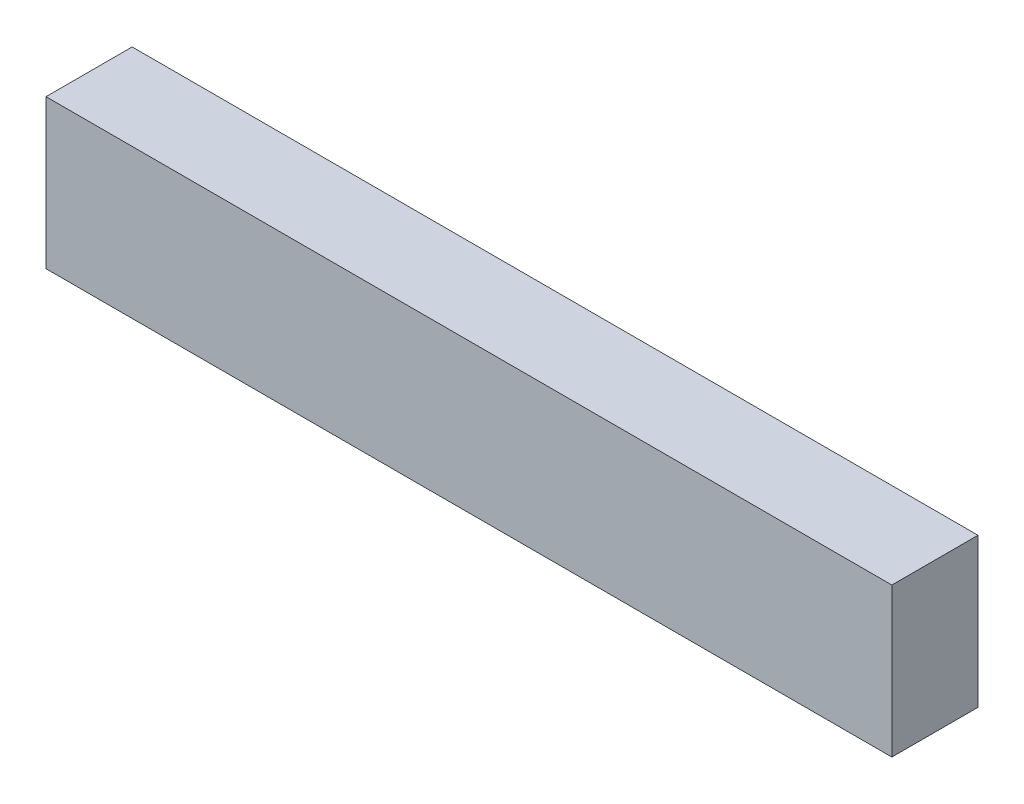
ISO-10303-21;
HEADER;
FILE_DESCRIPTION(('STEP AP214'),'2;1');
FILE_NAME('part.step','',(''),(''),'','','');
FILE_SCHEMA(('AUTOMOTIVE_DESIGN { 1 0 10303 214 1 1 1 1 }'));
ENDSEC;
DATA;
#1=APPLICATION_CONTEXT('core data for automotive mechanical design processes');
#2=APPLICATION_PROTOCOL_DEFINITION('international standard','automotive_design',2000,#1);
#3=PRODUCT_CONTEXT('',#1,'mechanical');
#4=PRODUCT('Part','Part','',(#3));
#5=PRODUCT_RELATED_PRODUCT_CATEGORY('part','',(#4));
#6=PRODUCT_DEFINITION_FORMATION('','',#4);
#7=PRODUCT_DEFINITION_CONTEXT('part definition',#1,'design');
#8=PRODUCT_DEFINITION('design','',#6,#7);
#9=PRODUCT_DEFINITION_SHAPE('','',#8);
#10=(LENGTH_UNIT() NAMED_UNIT(*) SI_UNIT(.MILLI.,.METRE.));
#11=(NAMED_UNIT(*) PLANE_ANGLE_UNIT() SI_UNIT($,.RADIAN.));
#12=(NAMED_UNIT(*) SI_UNIT($,.STERADIAN.) SOLID_ANGLE_UNIT());
#13=UNCERTAINTY_MEASURE_WITH_UNIT(LENGTH_MEASURE(1.E-05),#10,'distance_accuracy_value','');
#14=(GEOMETRIC_REPRESENTATION_CONTEXT(3) GLOBAL_UNCERTAINTY_ASSIGNED_CONTEXT((#13)) GLOBAL_UNIT_ASSIGNED_CONTEXT((#10,
#11,#12)) REPRESENTATION_CONTEXT('',''));
#15=CARTESIAN_POINT('',(0.,0.,0.));
#16=DIRECTION('',(0.,0.,1.));
#17=DIRECTION('',(1.,0.,0.));
#18=AXIS2_PLACEMENT_3D('',#15,#16,#17);
#19=CARTESIAN_POINT('',(-79.0368014902547,-1.68999999999998,7.25));
#20=DIRECTION('',(1.,0.,0.));
#21=DIRECTION('',(0.,0.,-1.));
#22=AXIS2_PLACEMENT_3D('',#19,#20,#21);
#23=PLANE('',#22);
#24=DIRECTION('',(0.,-1.,0.));
#25=VECTOR('',#24,1.);
#26=CARTESIAN_POINT('',(-79.0368014902547,-1.68999999999998,0.));
#27=LINE('',#26,#25);
#28=CARTESIAN_POINT('',(-79.0368014902547,-1.68999999999998,0.));
#29=VERTEX_POINT('',#28);
#30=CARTESIAN_POINT('',(-79.0368014902547,-14.23,0.));
#31=VERTEX_POINT('',#30);
#32=EDGE_CURVE('E128',#29,#31,#27,.T.);
#33=ORIENTED_EDGE('',*,*,#32,.T.);
#34=DIRECTION('',(0.,0.,-1.));
#35=VECTOR('',#34,1.);
#36=CARTESIAN_POINT('',(-79.0368014902547,-14.23,7.25));
#37=LINE('',#36,#35);
#38=CARTESIAN_POINT('',(-79.0368014902547,-14.23,7.25));
#39=VERTEX_POINT('',#38);
#40=EDGE_CURVE('E11',#39,#31,#37,.T.);
#41=ORIENTED_EDGE('',*,*,#40,.F.);
#42=DIRECTION('',(0.,-1.,0.));
#43=VECTOR('',#42,1.);
#44=CARTESIAN_POINT('',(-79.0368014902547,-1.68999999999998,7.25));
#45=LINE('',#44,#43);
#46=CARTESIAN_POINT('',(-79.0368014902547,-1.68999999999998,7.25));
#47=VERTEX_POINT('',#46);
#48=EDGE_CURVE('E148',#47,#39,#45,.T.);
#49=ORIENTED_EDGE('',*,*,#48,.F.);
#50=DIRECTION('',(0.,0.,-1.));
#51=VECTOR('',#50,1.);
#52=CARTESIAN_POINT('',(-79.0368014902547,-1.68999999999998,7.25));
#53=LINE('',#52,#51);
#54=EDGE_CURVE('E153',#47,#29,#53,.T.);
#55=ORIENTED_EDGE('',*,*,#54,.T.);
#56=EDGE_LOOP('',(#33,#41,#49,#55));
#57=FACE_BOUND('',#56,.T.);
#58=ADVANCED_FACE('F32',(#57),#23,.F.);
#59=CARTESIAN_POINT('',(-79.0368014902547,-14.23,7.25));
#60=DIRECTION('',(0.,1.,0.));
#61=DIRECTION('',(0.,0.,1.));
#62=AXIS2_PLACEMENT_3D('',#59,#60,#61);
#63=PLANE('',#62);
#64=DIRECTION('',(1.,0.,0.));
#65=VECTOR('',#64,1.);
#66=CARTESIAN_POINT('',(-79.0368014902547,-14.23,0.));
#67=LINE('',#66,#65);
#68=CARTESIAN_POINT('',(-7.85549999999964,-14.23,0.));
#69=VERTEX_POINT('',#68);
#70=EDGE_CURVE('E132',#31,#69,#67,.T.);
#71=ORIENTED_EDGE('',*,*,#70,.T.);
#72=DIRECTION('',(0.,0.,-1.));
#73=VECTOR('',#72,1.);
#74=CARTESIAN_POINT('',(-7.85549999999964,-14.23,7.25));
#75=LINE('',#74,#73);
#76=CARTESIAN_POINT('',(-7.85549999999964,-14.23,7.25));
#77=VERTEX_POINT('',#76);
#78=EDGE_CURVE('E39',#77,#69,#75,.T.);
#79=ORIENTED_EDGE('',*,*,#78,.F.);
#80=DIRECTION('',(1.,0.,0.));
#81=VECTOR('',#80,1.);
#82=CARTESIAN_POINT('',(-79.0368014902547,-14.23,7.25));
#83=LINE('',#82,#81);
#84=EDGE_CURVE('E83',#39,#77,#83,.T.);
#85=ORIENTED_EDGE('',*,*,#84,.F.);
#86=ORIENTED_EDGE('',*,*,#40,.T.);
#87=EDGE_LOOP('',(#71,#79,#85,#86));
#88=FACE_BOUND('',#87,.T.);
#89=ADVANCED_FACE('F182',(#88),#63,.F.);
#90=CARTESIAN_POINT('',(-7.85549999999964,-1.68999999999998,7.25));
#91=DIRECTION('',(-1.,0.,0.));
#92=DIRECTION('',(0.,0.,1.));
#93=AXIS2_PLACEMENT_3D('',#90,#91,#92);
#94=PLANE('',#93);
#95=DIRECTION('',(0.,1.,0.));
#96=VECTOR('',#95,1.);
#97=CARTESIAN_POINT('',(-7.85549999999964,-1.68999999999998,0.));
#98=LINE('',#97,#96);
#99=CARTESIAN_POINT('',(-7.85549999999964,-1.68999999999998,0.));
#100=VERTEX_POINT('',#99);
#101=EDGE_CURVE('E156',#69,#100,#98,.T.);
#102=ORIENTED_EDGE('',*,*,#101,.T.);
#103=DIRECTION('',(0.,0.,-1.));
#104=VECTOR('',#103,1.);
#105=CARTESIAN_POINT('',(-7.85549999999964,-1.68999999999998,7.25));
#106=LINE('',#105,#104);
#107=CARTESIAN_POINT('',(-7.85549999999964,-1.68999999999998,7.25));
#108=VERTEX_POINT('',#107);
#109=EDGE_CURVE('E160',#108,#100,#106,.T.);
#110=ORIENTED_EDGE('',*,*,#109,.F.);
#111=DIRECTION('',(0.,1.,0.));
#112=VECTOR('',#111,1.);
#113=CARTESIAN_POINT('',(-7.85549999999964,-1.68999999999998,7.25));
#114=LINE('',#113,#112);
#115=EDGE_CURVE('E151',#77,#108,#114,.T.);
#116=ORIENTED_EDGE('',*,*,#115,.F.);
#117=ORIENTED_EDGE('',*,*,#78,.T.);
#118=EDGE_LOOP('',(#102,#110,#116,#117));
#119=FACE_BOUND('',#118,.T.);
#120=ADVANCED_FACE('F165',(#119),#94,.F.);
#121=CARTESIAN_POINT('',(-79.0368014902547,-1.68999999999998,7.25));
#122=DIRECTION('',(0.,-1.,0.));
#123=DIRECTION('',(0.,0.,-1.));
#124=AXIS2_PLACEMENT_3D('',#121,#122,#123);
#125=PLANE('',#124);
#126=DIRECTION('',(-1.,0.,0.));
#127=VECTOR('',#126,1.);
#128=CARTESIAN_POINT('',(-79.0368014902547,-1.68999999999998,0.));
#129=LINE('',#128,#127);
#130=EDGE_CURVE('E76',#100,#29,#129,.T.);
#131=ORIENTED_EDGE('',*,*,#130,.T.);
#132=ORIENTED_EDGE('',*,*,#54,.F.);
#133=DIRECTION('',(-1.,0.,0.));
#134=VECTOR('',#133,1.);
#135=CARTESIAN_POINT('',(-79.0368014902547,-1.68999999999998,7.25));
#136=LINE('',#135,#134);
#137=EDGE_CURVE('E55',#108,#47,#136,.T.);
#138=ORIENTED_EDGE('',*,*,#137,.F.);
#139=ORIENTED_EDGE('',*,*,#109,.T.);
#140=EDGE_LOOP('',(#131,#132,#138,#139));
#141=FACE_BOUND('',#140,.T.);
#142=ADVANCED_FACE('F173',(#141),#125,.F.);
#143=CARTESIAN_POINT('',(0.,0.,7.25));
#144=DIRECTION('',(0.,0.,1.));
#145=DIRECTION('',(1.,0.,0.));
#146=AXIS2_PLACEMENT_3D('',#143,#144,#145);
#147=PLANE('',#146);
#148=ORIENTED_EDGE('',*,*,#48,.T.);
#149=ORIENTED_EDGE('',*,*,#84,.T.);
#150=ORIENTED_EDGE('',*,*,#115,.T.);
#151=ORIENTED_EDGE('',*,*,#137,.T.);
#152=EDGE_LOOP('',(#148,#149,#150,#151));
#153=FACE_BOUND('',#152,.T.);
#154=ADVANCED_FACE('F175',(#153),#147,.T.);
#155=CARTESIAN_POINT('',(0.,0.,0.));
#156=DIRECTION('',(0.,0.,1.));
#157=DIRECTION('',(1.,0.,0.));
#158=AXIS2_PLACEMENT_3D('',#155,#156,#157);
#159=PLANE('',#158);
#160=DIRECTION('',(-1.,0.,0.));
#161=VECTOR('',#160,1.);
#162=CARTESIAN_POINT('',(-79.0368014902547,-2.18999999999998,0.));
#163=LINE('',#162,#161);
#164=CARTESIAN_POINT('',(-8.35549999999964,-2.18999999999998,0.));
#165=VERTEX_POINT('',#164);
#166=CARTESIAN_POINT('',(-78.5368014902547,-2.18999999999998,0.));
#167=VERTEX_POINT('',#166);
#168=EDGE_CURVE('E123',#165,#167,#163,.T.);
#169=ORIENTED_EDGE('',*,*,#168,.T.);
#170=DIRECTION('',(0.,-1.,0.));
#171=VECTOR('',#170,1.);
#172=CARTESIAN_POINT('',(-78.5368014902547,-1.68999999999998,0.));
#173=LINE('',#172,#171);
#174=CARTESIAN_POINT('',(-78.5368014902547,-13.73,0.));
#175=VERTEX_POINT('',#174);
#176=EDGE_CURVE('E142',#167,#175,#173,.T.);
#177=ORIENTED_EDGE('',*,*,#176,.T.);
#178=DIRECTION('',(1.,0.,0.));
#179=VECTOR('',#178,1.);
#180=CARTESIAN_POINT('',(-79.0368014902547,-13.73,0.));
#181=LINE('',#180,#179);
#182=CARTESIAN_POINT('',(-8.35549999999964,-13.73,0.));
#183=VERTEX_POINT('',#182);
#184=EDGE_CURVE('E127',#175,#183,#181,.T.);
#185=ORIENTED_EDGE('',*,*,#184,.T.);
#186=DIRECTION('',(0.,1.,0.));
#187=VECTOR('',#186,1.);
#188=CARTESIAN_POINT('',(-8.35549999999964,-1.68999999999998,0.));
#189=LINE('',#188,#187);
#190=EDGE_CURVE('E46',#183,#165,#189,.T.);
#191=ORIENTED_EDGE('',*,*,#190,.T.);
#192=EDGE_LOOP('',(#169,#177,#185,#191));
#193=FACE_BOUND('',#192,.T.);
#194=ORIENTED_EDGE('',*,*,#32,.F.);
#195=ORIENTED_EDGE('',*,*,#130,.F.);
#196=ORIENTED_EDGE('',*,*,#101,.F.);
#197=ORIENTED_EDGE('',*,*,#70,.F.);
#198=EDGE_LOOP('',(#194,#195,#196,#197));
#199=FACE_BOUND('',#198,.T.);
#200=ADVANCED_FACE('F169',(#193,#199),#159,.F.);
#201=CARTESIAN_POINT('',(-78.5368014902547,-1.68999999999998,7.25));
#202=DIRECTION('',(1.,0.,0.));
#203=DIRECTION('',(0.,0.,-1.));
#204=AXIS2_PLACEMENT_3D('',#201,#202,#203);
#205=PLANE('',#204);
#206=ORIENTED_EDGE('',*,*,#176,.F.);
#207=DIRECTION('',(0.,0.,-1.));
#208=VECTOR('',#207,1.);
#209=CARTESIAN_POINT('',(-78.5368014902547,-2.18999999999998,7.25));
#210=LINE('',#209,#208);
#211=CARTESIAN_POINT('',(-78.5368014902547,-2.18999999999998,7.05));
#212=VERTEX_POINT('',#211);
#213=EDGE_CURVE('E122',#212,#167,#210,.T.);
#214=ORIENTED_EDGE('',*,*,#213,.F.);
#215=DIRECTION('',(0.,-1.,0.));
#216=VECTOR('',#215,1.);
#217=CARTESIAN_POINT('',(-78.5368014902547,-1.68999999999998,7.05));
#218=LINE('',#217,#216);
#219=CARTESIAN_POINT('',(-78.5368014902547,-13.73,7.05));
#220=VERTEX_POINT('',#219);
#221=EDGE_CURVE('E110',#212,#220,#218,.T.);
#222=ORIENTED_EDGE('',*,*,#221,.T.);
#223=DIRECTION('',(0.,0.,-1.));
#224=VECTOR('',#223,1.);
#225=CARTESIAN_POINT('',(-78.5368014902547,-13.73,7.25));
#226=LINE('',#225,#224);
#227=EDGE_CURVE('E120',#220,#175,#226,.T.);
#228=ORIENTED_EDGE('',*,*,#227,.T.);
#229=EDGE_LOOP('',(#206,#214,#222,#228));
#230=FACE_BOUND('',#229,.T.);
#231=ADVANCED_FACE('F119',(#230),#205,.T.);
#232=CARTESIAN_POINT('',(-79.0368014902547,-13.73,7.25));
#233=DIRECTION('',(0.,1.,0.));
#234=DIRECTION('',(0.,0.,1.));
#235=AXIS2_PLACEMENT_3D('',#232,#233,#234);
#236=PLANE('',#235);
#237=ORIENTED_EDGE('',*,*,#184,.F.);
#238=ORIENTED_EDGE('',*,*,#227,.F.);
#239=DIRECTION('',(1.,0.,0.));
#240=VECTOR('',#239,1.);
#241=CARTESIAN_POINT('',(-79.0368014902547,-13.73,7.05));
#242=LINE('',#241,#240);
#243=CARTESIAN_POINT('',(-8.35549999999964,-13.73,7.05));
#244=VERTEX_POINT('',#243);
#245=EDGE_CURVE('E106',#220,#244,#242,.T.);
#246=ORIENTED_EDGE('',*,*,#245,.T.);
#247=DIRECTION('',(0.,0.,-1.));
#248=VECTOR('',#247,1.);
#249=CARTESIAN_POINT('',(-8.35549999999964,-13.73,7.25));
#250=LINE('',#249,#248);
#251=EDGE_CURVE('E129',#244,#183,#250,.T.);
#252=ORIENTED_EDGE('',*,*,#251,.T.);
#253=EDGE_LOOP('',(#237,#238,#246,#252));
#254=FACE_BOUND('',#253,.T.);
#255=ADVANCED_FACE('F125',(#254),#236,.T.);
#256=CARTESIAN_POINT('',(-8.35549999999964,-1.68999999999998,7.25));
#257=DIRECTION('',(-1.,0.,0.));
#258=DIRECTION('',(0.,0.,1.));
#259=AXIS2_PLACEMENT_3D('',#256,#257,#258);
#260=PLANE('',#259);
#261=ORIENTED_EDGE('',*,*,#190,.F.);
#262=ORIENTED_EDGE('',*,*,#251,.F.);
#263=DIRECTION('',(0.,1.,0.));
#264=VECTOR('',#263,1.);
#265=CARTESIAN_POINT('',(-8.35549999999964,-1.68999999999998,7.05));
#266=LINE('',#265,#264);
#267=CARTESIAN_POINT('',(-8.35549999999964,-2.18999999999998,7.05));
#268=VERTEX_POINT('',#267);
#269=EDGE_CURVE('E111',#244,#268,#266,.T.);
#270=ORIENTED_EDGE('',*,*,#269,.T.);
#271=DIRECTION('',(0.,0.,-1.));
#272=VECTOR('',#271,1.);
#273=CARTESIAN_POINT('',(-8.35549999999965,-2.18999999999998,7.25));
#274=LINE('',#273,#272);
#275=EDGE_CURVE('E134',#268,#165,#274,.T.);
#276=ORIENTED_EDGE('',*,*,#275,.T.);
#277=EDGE_LOOP('',(#261,#262,#270,#276));
#278=FACE_BOUND('',#277,.T.);
#279=ADVANCED_FACE('F230',(#278),#260,.T.);
#280=CARTESIAN_POINT('',(-79.0368014902547,-2.18999999999998,7.25));
#281=DIRECTION('',(0.,-1.,0.));
#282=DIRECTION('',(0.,0.,-1.));
#283=AXIS2_PLACEMENT_3D('',#280,#281,#282);
#284=PLANE('',#283);
#285=ORIENTED_EDGE('',*,*,#168,.F.);
#286=ORIENTED_EDGE('',*,*,#275,.F.);
#287=DIRECTION('',(-1.,0.,0.));
#288=VECTOR('',#287,1.);
#289=CARTESIAN_POINT('',(-79.0368014902547,-2.18999999999998,7.05));
#290=LINE('',#289,#288);
#291=EDGE_CURVE('E137',#268,#212,#290,.T.);
#292=ORIENTED_EDGE('',*,*,#291,.T.);
#293=ORIENTED_EDGE('',*,*,#213,.T.);
#294=EDGE_LOOP('',(#285,#286,#292,#293));
#295=FACE_BOUND('',#294,.T.);
#296=ADVANCED_FACE('F239',(#295),#284,.T.);
#297=CARTESIAN_POINT('',(0.,0.,7.05));
#298=DIRECTION('',(0.,0.,1.));
#299=DIRECTION('',(1.,0.,0.));
#300=AXIS2_PLACEMENT_3D('',#297,#298,#299);
#301=PLANE('',#300);
#302=ORIENTED_EDGE('',*,*,#221,.F.);
#303=ORIENTED_EDGE('',*,*,#291,.F.);
#304=ORIENTED_EDGE('',*,*,#269,.F.);
#305=ORIENTED_EDGE('',*,*,#245,.F.);
#306=EDGE_LOOP('',(#302,#303,#304,#305));
#307=FACE_BOUND('',#306,.T.);
#308=ADVANCED_FACE('F108',(#307),#301,.F.);
#309=CLOSED_SHELL('',(#58,#89,#120,#142,#154,#200,#231,#255,#279,#296,#308));
#310=MANIFOLD_SOLID_BREP('B2',#309);
#311=ADVANCED_BREP_SHAPE_REPRESENTATION('',(#18,#310),#14);
#312=SHAPE_DEFINITION_REPRESENTATION(#9,#311);
ENDSEC;
END-ISO-10303-21;
